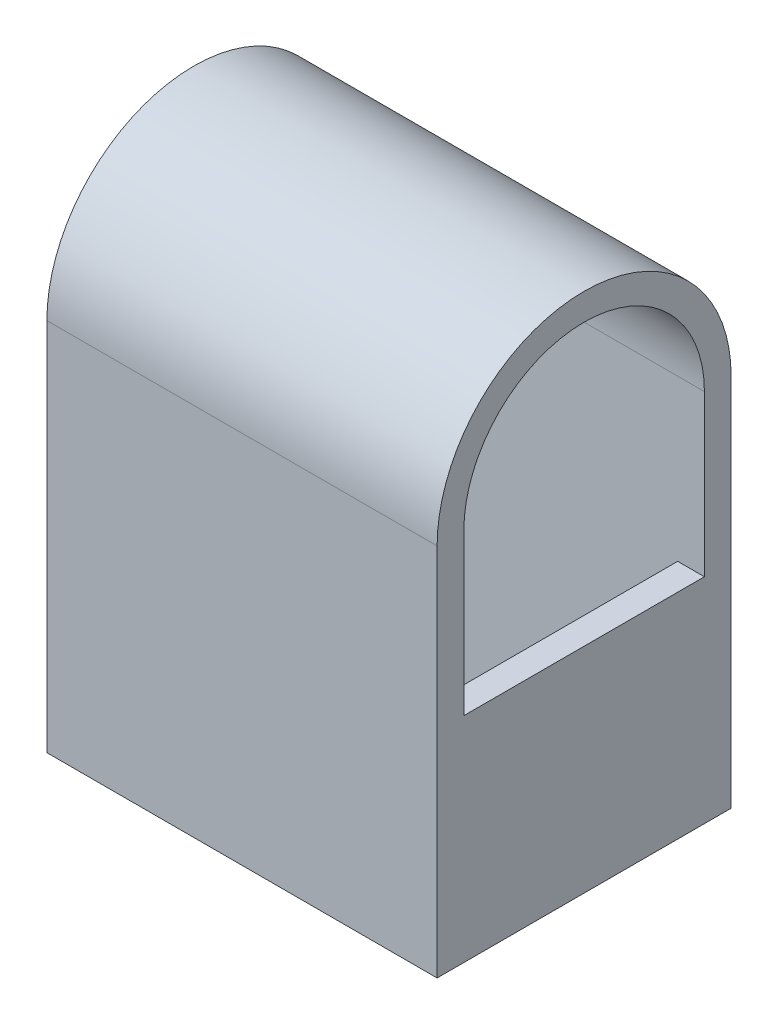
ISO-10303-21;
HEADER;
FILE_DESCRIPTION(('STEP AP214'),'2;1');
FILE_NAME('part.step','',(''),(''),'','','');
FILE_SCHEMA(('AUTOMOTIVE_DESIGN { 1 0 10303 214 1 1 1 1 }'));
ENDSEC;
DATA;
#1=APPLICATION_CONTEXT('core data for automotive mechanical design processes');
#2=APPLICATION_PROTOCOL_DEFINITION('international standard','automotive_design',2000,#1);
#3=PRODUCT_CONTEXT('',#1,'mechanical');
#4=PRODUCT('Part','Part','',(#3));
#5=PRODUCT_RELATED_PRODUCT_CATEGORY('part','',(#4));
#6=PRODUCT_DEFINITION_FORMATION('','',#4);
#7=PRODUCT_DEFINITION_CONTEXT('part definition',#1,'design');
#8=PRODUCT_DEFINITION('design','',#6,#7);
#9=PRODUCT_DEFINITION_SHAPE('','',#8);
#10=(LENGTH_UNIT() NAMED_UNIT(*) SI_UNIT(.MILLI.,.METRE.));
#11=(NAMED_UNIT(*) PLANE_ANGLE_UNIT() SI_UNIT($,.RADIAN.));
#12=(NAMED_UNIT(*) SI_UNIT($,.STERADIAN.) SOLID_ANGLE_UNIT());
#13=UNCERTAINTY_MEASURE_WITH_UNIT(LENGTH_MEASURE(1.E-05),#10,'distance_accuracy_value','');
#14=(GEOMETRIC_REPRESENTATION_CONTEXT(3) GLOBAL_UNCERTAINTY_ASSIGNED_CONTEXT((#13)) GLOBAL_UNIT_ASSIGNED_CONTEXT((#10,
#11,#12)) REPRESENTATION_CONTEXT('',''));
#15=CARTESIAN_POINT('',(0.,0.,0.));
#16=DIRECTION('',(0.,0.,1.));
#17=DIRECTION('',(1.,0.,0.));
#18=AXIS2_PLACEMENT_3D('',#15,#16,#17);
#19=CARTESIAN_POINT('',(0.,0.,-13.97));
#20=DIRECTION('',(0.,0.,1.));
#21=DIRECTION('',(1.,0.,0.));
#22=AXIS2_PLACEMENT_3D('',#19,#20,#21);
#23=PLANE('',#22);
#24=DIRECTION('',(0.,-1.,0.));
#25=VECTOR('',#24,1.);
#26=CARTESIAN_POINT('',(6.35,-8.89,-13.97));
#27=LINE('',#26,#25);
#28=CARTESIAN_POINT('',(6.35,3.81,-13.97));
#29=VERTEX_POINT('',#28);
#30=CARTESIAN_POINT('',(6.35,-8.89000000000001,-13.97));
#31=VERTEX_POINT('',#30);
#32=EDGE_CURVE('E218',#29,#31,#27,.T.);
#33=ORIENTED_EDGE('',*,*,#32,.F.);
#34=DIRECTION('',(1.,0.,0.));
#35=VECTOR('',#34,1.);
#36=CARTESIAN_POINT('',(6.35,3.81,-13.97));
#37=LINE('',#36,#35);
#38=CARTESIAN_POINT('',(5.08,3.81,-13.97));
#39=VERTEX_POINT('',#38);
#40=EDGE_CURVE('E241',#39,#29,#37,.T.);
#41=ORIENTED_EDGE('',*,*,#40,.F.);
#42=DIRECTION('',(0.,1.,0.));
#43=VECTOR('',#42,1.);
#44=CARTESIAN_POINT('',(5.08,-8.89000000000001,-13.97));
#45=LINE('',#44,#43);
#46=CARTESIAN_POINT('',(5.08,-8.89000000000001,-13.97));
#47=VERTEX_POINT('',#46);
#48=EDGE_CURVE('E216',#47,#39,#45,.T.);
#49=ORIENTED_EDGE('',*,*,#48,.F.);
#50=DIRECTION('',(1.,0.,0.));
#51=VECTOR('',#50,1.);
#52=CARTESIAN_POINT('',(-5.08,-8.89000000000001,-13.97));
#53=LINE('',#52,#51);
#54=CARTESIAN_POINT('',(-5.08,-8.89000000000001,-13.97));
#55=VERTEX_POINT('',#54);
#56=EDGE_CURVE('E206',#55,#47,#53,.T.);
#57=ORIENTED_EDGE('',*,*,#56,.F.);
#58=DIRECTION('',(0.,1.,0.));
#59=VECTOR('',#58,1.);
#60=CARTESIAN_POINT('',(-5.08,-8.89000000000001,-13.97));
#61=LINE('',#60,#59);
#62=CARTESIAN_POINT('',(-5.08,3.81,-13.97));
#63=VERTEX_POINT('',#62);
#64=EDGE_CURVE('E219',#55,#63,#61,.T.);
#65=ORIENTED_EDGE('',*,*,#64,.T.);
#66=CARTESIAN_POINT('',(-6.35,3.81,-13.97));
#67=VERTEX_POINT('',#66);
#68=EDGE_CURVE('E229',#67,#63,#37,.T.);
#69=ORIENTED_EDGE('',*,*,#68,.F.);
#70=DIRECTION('',(0.,1.,0.));
#71=VECTOR('',#70,1.);
#72=CARTESIAN_POINT('',(-6.35,3.81,-13.97));
#73=LINE('',#72,#71);
#74=CARTESIAN_POINT('',(-6.35,-8.89000000000001,-13.97));
#75=VERTEX_POINT('',#74);
#76=EDGE_CURVE('E238',#75,#67,#73,.T.);
#77=ORIENTED_EDGE('',*,*,#76,.F.);
#78=DIRECTION('',(1.,0.,0.));
#79=VECTOR('',#78,1.);
#80=CARTESIAN_POINT('',(9.271,-8.89000000000001,-13.97));
#81=LINE('',#80,#79);
#82=CARTESIAN_POINT('',(-9.271,-8.89000000000001,-13.97));
#83=VERTEX_POINT('',#82);
#84=EDGE_CURVE('E287',#83,#75,#81,.T.);
#85=ORIENTED_EDGE('',*,*,#84,.F.);
#86=DIRECTION('',(0.,-1.,0.));
#87=VECTOR('',#86,1.);
#88=CARTESIAN_POINT('',(-9.271,-8.89000000000001,-13.97));
#89=LINE('',#88,#87);
#90=CARTESIAN_POINT('',(-9.271,8.88999999999999,-13.97));
#91=VERTEX_POINT('',#90);
#92=EDGE_CURVE('E273',#91,#83,#89,.T.);
#93=ORIENTED_EDGE('',*,*,#92,.F.);
#94=DIRECTION('',(-1.,0.,0.));
#95=VECTOR('',#94,1.);
#96=CARTESIAN_POINT('',(24.889934822836,8.88999999999999,-13.97));
#97=LINE('',#96,#95);
#98=CARTESIAN_POINT('',(9.271,8.89,-13.97));
#99=VERTEX_POINT('',#98);
#100=EDGE_CURVE('E304',#99,#91,#97,.T.);
#101=ORIENTED_EDGE('',*,*,#100,.F.);
#102=DIRECTION('',(0.,1.,0.));
#103=VECTOR('',#102,1.);
#104=CARTESIAN_POINT('',(9.271,-8.89000000000001,-13.97));
#105=LINE('',#104,#103);
#106=CARTESIAN_POINT('',(9.271,-8.89000000000001,-13.97));
#107=VERTEX_POINT('',#106);
#108=EDGE_CURVE('E279',#107,#99,#105,.T.);
#109=ORIENTED_EDGE('',*,*,#108,.F.);
#110=EDGE_CURVE('E286',#31,#107,#81,.T.);
#111=ORIENTED_EDGE('',*,*,#110,.F.);
#112=EDGE_LOOP('',(#33,#41,#49,#57,#65,#69,#77,#85,#93,#101,#109,#111));
#113=FACE_BOUND('',#112,.T.);
#114=ADVANCED_FACE('F33',(#113),#23,.F.);
#115=CARTESIAN_POINT('',(9.271,-8.89,-1.27));
#116=DIRECTION('',(1.,0.,0.));
#117=DIRECTION('',(0.,0.,-1.));
#118=AXIS2_PLACEMENT_3D('',#115,#116,#117);
#119=PLANE('',#118);
#120=DIRECTION('',(0.,0.,1.));
#121=VECTOR('',#120,1.);
#122=CARTESIAN_POINT('',(9.271,1.27,-1.905));
#123=LINE('',#122,#121);
#124=CARTESIAN_POINT('',(9.271,1.27,-12.7));
#125=VERTEX_POINT('',#124);
#126=CARTESIAN_POINT('',(9.271,1.27,-1.27));
#127=VERTEX_POINT('',#126);
#128=EDGE_CURVE('E48',#125,#127,#123,.T.);
#129=ORIENTED_EDGE('',*,*,#128,.T.);
#130=DIRECTION('',(0.,1.,0.));
#131=VECTOR('',#130,1.);
#132=CARTESIAN_POINT('',(9.271,-8.89,-1.27));
#133=LINE('',#132,#131);
#134=CARTESIAN_POINT('',(9.271,8.89,-1.27));
#135=VERTEX_POINT('',#134);
#136=EDGE_CURVE('E189',#127,#135,#133,.T.);
#137=ORIENTED_EDGE('',*,*,#136,.T.);
#138=CARTESIAN_POINT('',(9.271,8.89,-6.985));
#139=DIRECTION('',(1.,0.,0.));
#140=DIRECTION('',(0.,0.,-1.));
#141=AXIS2_PLACEMENT_3D('',#138,#139,#140);
#142=CIRCLE('',#141,5.715);
#143=CARTESIAN_POINT('',(9.271,8.88999999999999,-12.7));
#144=VERTEX_POINT('',#143);
#145=EDGE_CURVE('E298',#144,#135,#142,.T.);
#146=ORIENTED_EDGE('',*,*,#145,.F.);
#147=DIRECTION('',(0.,1.,0.));
#148=VECTOR('',#147,1.);
#149=CARTESIAN_POINT('',(9.271,-8.89000000000001,-12.7));
#150=LINE('',#149,#148);
#151=EDGE_CURVE('E281',#125,#144,#150,.T.);
#152=ORIENTED_EDGE('',*,*,#151,.F.);
#153=EDGE_LOOP('',(#129,#137,#146,#152));
#154=FACE_BOUND('',#153,.T.);
#155=DIRECTION('',(0.,1.,0.));
#156=VECTOR('',#155,1.);
#157=CARTESIAN_POINT('',(9.271,-8.89,0.));
#158=LINE('',#157,#156);
#159=CARTESIAN_POINT('',(9.271,-8.89,0.));
#160=VERTEX_POINT('',#159);
#161=CARTESIAN_POINT('',(9.271,8.89,0.));
#162=VERTEX_POINT('',#161);
#163=EDGE_CURVE('E301',#160,#162,#158,.T.);
#164=ORIENTED_EDGE('',*,*,#163,.F.);
#165=DIRECTION('',(0.,0.,1.));
#166=VECTOR('',#165,1.);
#167=CARTESIAN_POINT('',(9.271,-8.89,-1.27));
#168=LINE('',#167,#166);
#169=EDGE_CURVE('E11',#107,#160,#168,.T.);
#170=ORIENTED_EDGE('',*,*,#169,.F.);
#171=ORIENTED_EDGE('',*,*,#108,.T.);
#172=CARTESIAN_POINT('',(9.271,8.89,-6.985));
#173=DIRECTION('',(1.,0.,0.));
#174=DIRECTION('',(0.,0.,-1.));
#175=AXIS2_PLACEMENT_3D('',#172,#173,#174);
#176=CIRCLE('',#175,6.985);
#177=EDGE_CURVE('E295',#162,#99,#176,.F.);
#178=ORIENTED_EDGE('',*,*,#177,.F.);
#179=EDGE_LOOP('',(#164,#170,#171,#178));
#180=FACE_BOUND('',#179,.T.);
#181=ADVANCED_FACE('F35',(#154,#180),#119,.T.);
#182=CARTESIAN_POINT('',(-9.271,-8.89,-1.27));
#183=DIRECTION('',(0.,-1.,0.));
#184=DIRECTION('',(0.,0.,-1.));
#185=AXIS2_PLACEMENT_3D('',#182,#183,#184);
#186=PLANE('',#185);
#187=ORIENTED_EDGE('',*,*,#110,.T.);
#188=ORIENTED_EDGE('',*,*,#169,.T.);
#189=DIRECTION('',(1.,0.,0.));
#190=VECTOR('',#189,1.);
#191=CARTESIAN_POINT('',(-9.271,-8.89,0.));
#192=LINE('',#191,#190);
#193=CARTESIAN_POINT('',(-9.271,-8.89,0.));
#194=VERTEX_POINT('',#193);
#195=EDGE_CURVE('E310',#194,#160,#192,.T.);
#196=ORIENTED_EDGE('',*,*,#195,.F.);
#197=DIRECTION('',(0.,0.,1.));
#198=VECTOR('',#197,1.);
#199=CARTESIAN_POINT('',(-9.271,-8.89,-1.27));
#200=LINE('',#199,#198);
#201=EDGE_CURVE('E37',#83,#194,#200,.T.);
#202=ORIENTED_EDGE('',*,*,#201,.F.);
#203=ORIENTED_EDGE('',*,*,#84,.T.);
#204=DIRECTION('',(0.,0.,1.));
#205=VECTOR('',#204,1.);
#206=CARTESIAN_POINT('',(-6.35,-8.89,-16.256));
#207=LINE('',#206,#205);
#208=CARTESIAN_POINT('',(-6.35,-8.89,-16.256));
#209=VERTEX_POINT('',#208);
#210=EDGE_CURVE('E249',#209,#75,#207,.T.);
#211=ORIENTED_EDGE('',*,*,#210,.F.);
#212=DIRECTION('',(-1.,0.,0.));
#213=VECTOR('',#212,1.);
#214=CARTESIAN_POINT('',(-6.35,-8.89,-16.256));
#215=LINE('',#214,#213);
#216=CARTESIAN_POINT('',(6.35,-8.89,-16.256));
#217=VERTEX_POINT('',#216);
#218=EDGE_CURVE('E228',#217,#209,#215,.T.);
#219=ORIENTED_EDGE('',*,*,#218,.F.);
#220=DIRECTION('',(0.,0.,1.));
#221=VECTOR('',#220,1.);
#222=CARTESIAN_POINT('',(6.35,-8.89,-16.256));
#223=LINE('',#222,#221);
#224=EDGE_CURVE('E252',#217,#31,#223,.T.);
#225=ORIENTED_EDGE('',*,*,#224,.T.);
#226=EDGE_LOOP('',(#187,#188,#196,#202,#203,#211,#219,#225));
#227=FACE_BOUND('',#226,.T.);
#228=DIRECTION('',(0.,0.,-1.));
#229=VECTOR('',#228,1.);
#230=CARTESIAN_POINT('',(5.08,-8.89000000000001,-13.97));
#231=LINE('',#230,#229);
#232=CARTESIAN_POINT('',(5.08,-8.89000000000001,-15.4932753966179));
#233=VERTEX_POINT('',#232);
#234=EDGE_CURVE('E196',#47,#233,#231,.T.);
#235=ORIENTED_EDGE('',*,*,#234,.T.);
#236=DIRECTION('',(-0.99968586256154,0.,-0.0250634433905168));
#237=VECTOR('',#236,1.);
#238=CARTESIAN_POINT('',(5.08,-8.89000000000001,-15.4932753966179));
#239=LINE('',#238,#237);
#240=CARTESIAN_POINT('',(-5.08,-8.89,-15.748));
#241=VERTEX_POINT('',#240);
#242=EDGE_CURVE('E199',#233,#241,#239,.T.);
#243=ORIENTED_EDGE('',*,*,#242,.T.);
#244=DIRECTION('',(0.,0.,1.));
#245=VECTOR('',#244,1.);
#246=CARTESIAN_POINT('',(-5.08,-8.89000000000001,-15.748));
#247=LINE('',#246,#245);
#248=EDGE_CURVE('E203',#241,#55,#247,.T.);
#249=ORIENTED_EDGE('',*,*,#248,.T.);
#250=ORIENTED_EDGE('',*,*,#56,.T.);
#251=EDGE_LOOP('',(#235,#243,#249,#250));
#252=FACE_BOUND('',#251,.T.);
#253=DIRECTION('',(1.,0.,0.));
#254=VECTOR('',#253,1.);
#255=CARTESIAN_POINT('',(-9.271,-8.89,-1.27));
#256=LINE('',#255,#254);
#257=CARTESIAN_POINT('',(-8.001,-8.89,-1.27));
#258=VERTEX_POINT('',#257);
#259=CARTESIAN_POINT('',(8.001,-8.89,-1.27));
#260=VERTEX_POINT('',#259);
#261=EDGE_CURVE('E315',#258,#260,#256,.T.);
#262=ORIENTED_EDGE('',*,*,#261,.T.);
#263=DIRECTION('',(0.,0.,-1.));
#264=VECTOR('',#263,1.);
#265=CARTESIAN_POINT('',(8.001,-8.89,-1.27));
#266=LINE('',#265,#264);
#267=CARTESIAN_POINT('',(8.001,-8.89000000000001,-12.7));
#268=VERTEX_POINT('',#267);
#269=EDGE_CURVE('E182',#260,#268,#266,.T.);
#270=ORIENTED_EDGE('',*,*,#269,.T.);
#271=DIRECTION('',(1.,0.,0.));
#272=VECTOR('',#271,1.);
#273=CARTESIAN_POINT('',(9.271,-8.89000000000001,-12.7));
#274=LINE('',#273,#272);
#275=CARTESIAN_POINT('',(-8.001,-8.89000000000001,-12.7));
#276=VERTEX_POINT('',#275);
#277=EDGE_CURVE('E278',#276,#268,#274,.T.);
#278=ORIENTED_EDGE('',*,*,#277,.F.);
#279=DIRECTION('',(0.,0.,1.));
#280=VECTOR('',#279,1.);
#281=CARTESIAN_POINT('',(-8.001,-8.89000000000001,-12.7));
#282=LINE('',#281,#280);
#283=EDGE_CURVE('E258',#276,#258,#282,.T.);
#284=ORIENTED_EDGE('',*,*,#283,.T.);
#285=EDGE_LOOP('',(#262,#270,#278,#284));
#286=FACE_BOUND('',#285,.T.);
#287=ADVANCED_FACE('F333',(#227,#252,#286),#186,.T.);
#288=CARTESIAN_POINT('',(-9.271,-8.89,-1.27));
#289=DIRECTION('',(-1.,0.,0.));
#290=DIRECTION('',(0.,0.,1.));
#291=AXIS2_PLACEMENT_3D('',#288,#289,#290);
#292=PLANE('',#291);
#293=DIRECTION('',(0.,-1.,0.));
#294=VECTOR('',#293,1.);
#295=CARTESIAN_POINT('',(-9.271,-8.89,-1.27));
#296=LINE('',#295,#294);
#297=CARTESIAN_POINT('',(-9.271,8.89,-1.27));
#298=VERTEX_POINT('',#297);
#299=CARTESIAN_POINT('',(-9.271,1.27,-1.27));
#300=VERTEX_POINT('',#299);
#301=EDGE_CURVE('E312',#298,#300,#296,.T.);
#302=ORIENTED_EDGE('',*,*,#301,.T.);
#303=DIRECTION('',(0.,0.,-1.));
#304=VECTOR('',#303,1.);
#305=CARTESIAN_POINT('',(-9.271,1.26999999999999,-12.7));
#306=LINE('',#305,#304);
#307=CARTESIAN_POINT('',(-9.271,1.27,-12.7));
#308=VERTEX_POINT('',#307);
#309=EDGE_CURVE('E255',#300,#308,#306,.T.);
#310=ORIENTED_EDGE('',*,*,#309,.T.);
#311=DIRECTION('',(0.,-1.,0.));
#312=VECTOR('',#311,1.);
#313=CARTESIAN_POINT('',(-9.271,-8.89000000000001,-12.7));
#314=LINE('',#313,#312);
#315=CARTESIAN_POINT('',(-9.271,8.88999999999999,-12.7));
#316=VERTEX_POINT('',#315);
#317=EDGE_CURVE('E276',#316,#308,#314,.T.);
#318=ORIENTED_EDGE('',*,*,#317,.F.);
#319=CARTESIAN_POINT('',(-9.271,8.89,-6.985));
#320=DIRECTION('',(1.,0.,0.));
#321=DIRECTION('',(0.,0.,-1.));
#322=AXIS2_PLACEMENT_3D('',#319,#320,#321);
#323=CIRCLE('',#322,5.715);
#324=EDGE_CURVE('E283',#316,#298,#323,.T.);
#325=ORIENTED_EDGE('',*,*,#324,.T.);
#326=EDGE_LOOP('',(#302,#310,#318,#325));
#327=FACE_BOUND('',#326,.T.);
#328=DIRECTION('',(0.,-1.,0.));
#329=VECTOR('',#328,1.);
#330=CARTESIAN_POINT('',(-9.271,-8.89,0.));
#331=LINE('',#330,#329);
#332=CARTESIAN_POINT('',(-9.271,8.89,0.));
#333=VERTEX_POINT('',#332);
#334=EDGE_CURVE('E322',#333,#194,#331,.T.);
#335=ORIENTED_EDGE('',*,*,#334,.F.);
#336=CARTESIAN_POINT('',(-9.271,8.89,-6.985));
#337=DIRECTION('',(-1.,0.,0.));
#338=DIRECTION('',(0.,0.,1.));
#339=AXIS2_PLACEMENT_3D('',#336,#337,#338);
#340=CIRCLE('',#339,6.985);
#341=EDGE_CURVE('E292',#333,#91,#340,.T.);
#342=ORIENTED_EDGE('',*,*,#341,.T.);
#343=ORIENTED_EDGE('',*,*,#92,.T.);
#344=ORIENTED_EDGE('',*,*,#201,.T.);
#345=EDGE_LOOP('',(#335,#342,#343,#344));
#346=FACE_BOUND('',#345,.T.);
#347=ADVANCED_FACE('F344',(#327,#346),#292,.T.);
#348=CARTESIAN_POINT('',(0.,0.,-1.27));
#349=DIRECTION('',(0.,0.,-1.));
#350=DIRECTION('',(-1.,0.,0.));
#351=AXIS2_PLACEMENT_3D('',#348,#349,#350);
#352=PLANE('',#351);
#353=DIRECTION('',(1.,0.,0.));
#354=VECTOR('',#353,1.);
#355=CARTESIAN_POINT('',(8.001,1.27,-1.27));
#356=LINE('',#355,#354);
#357=CARTESIAN_POINT('',(8.001,1.27,-1.27));
#358=VERTEX_POINT('',#357);
#359=EDGE_CURVE('E173',#358,#127,#356,.T.);
#360=ORIENTED_EDGE('',*,*,#359,.F.);
#361=DIRECTION('',(0.,-1.,0.));
#362=VECTOR('',#361,1.);
#363=CARTESIAN_POINT('',(8.001,1.27,-1.27));
#364=LINE('',#363,#362);
#365=EDGE_CURVE('E177',#358,#260,#364,.T.);
#366=ORIENTED_EDGE('',*,*,#365,.T.);
#367=ORIENTED_EDGE('',*,*,#261,.F.);
#368=DIRECTION('',(0.,1.,0.));
#369=VECTOR('',#368,1.);
#370=CARTESIAN_POINT('',(-8.001,-8.89,-1.27));
#371=LINE('',#370,#369);
#372=CARTESIAN_POINT('',(-8.001,1.27,-1.27));
#373=VERTEX_POINT('',#372);
#374=EDGE_CURVE('E261',#258,#373,#371,.T.);
#375=ORIENTED_EDGE('',*,*,#374,.T.);
#376=DIRECTION('',(-1.,0.,0.));
#377=VECTOR('',#376,1.);
#378=CARTESIAN_POINT('',(-8.001,1.27,-1.27));
#379=LINE('',#378,#377);
#380=EDGE_CURVE('E267',#373,#300,#379,.T.);
#381=ORIENTED_EDGE('',*,*,#380,.T.);
#382=ORIENTED_EDGE('',*,*,#301,.F.);
#383=DIRECTION('',(-1.,0.,0.));
#384=VECTOR('',#383,1.);
#385=CARTESIAN_POINT('',(-9.271,8.89,-1.27));
#386=LINE('',#385,#384);
#387=EDGE_CURVE('E309',#135,#298,#386,.T.);
#388=ORIENTED_EDGE('',*,*,#387,.F.);
#389=ORIENTED_EDGE('',*,*,#136,.F.);
#390=EDGE_LOOP('',(#360,#366,#367,#375,#381,#382,#388,#389));
#391=FACE_BOUND('',#390,.T.);
#392=ADVANCED_FACE('F187',(#391),#352,.T.);
#393=CARTESIAN_POINT('',(0.,0.,0.));
#394=DIRECTION('',(0.,0.,-1.));
#395=DIRECTION('',(-1.,0.,0.));
#396=AXIS2_PLACEMENT_3D('',#393,#394,#395);
#397=PLANE('',#396);
#398=ORIENTED_EDGE('',*,*,#163,.T.);
#399=DIRECTION('',(-1.,0.,0.));
#400=VECTOR('',#399,1.);
#401=CARTESIAN_POINT('',(-9.271,8.89,0.));
#402=LINE('',#401,#400);
#403=EDGE_CURVE('E319',#162,#333,#402,.T.);
#404=ORIENTED_EDGE('',*,*,#403,.T.);
#405=ORIENTED_EDGE('',*,*,#334,.T.);
#406=ORIENTED_EDGE('',*,*,#195,.T.);
#407=EDGE_LOOP('',(#398,#404,#405,#406));
#408=FACE_BOUND('',#407,.T.);
#409=ADVANCED_FACE('F328',(#408),#397,.F.);
#410=CARTESIAN_POINT('',(24.889934822836,8.89,-6.985));
#411=DIRECTION('',(-1.,0.,0.));
#412=DIRECTION('',(0.,0.,1.));
#413=AXIS2_PLACEMENT_3D('',#410,#411,#412);
#414=CYLINDRICAL_SURFACE('',#413,6.985);
#415=ORIENTED_EDGE('',*,*,#403,.F.);
#416=ORIENTED_EDGE('',*,*,#177,.T.);
#417=ORIENTED_EDGE('',*,*,#100,.T.);
#418=ORIENTED_EDGE('',*,*,#341,.F.);
#419=EDGE_LOOP('',(#415,#416,#417,#418));
#420=FACE_BOUND('',#419,.T.);
#421=ADVANCED_FACE('F341',(#420),#414,.T.);
#422=CARTESIAN_POINT('',(24.889934822836,8.89,-6.985));
#423=DIRECTION('',(-1.,0.,0.));
#424=DIRECTION('',(0.,0.,1.));
#425=AXIS2_PLACEMENT_3D('',#422,#423,#424);
#426=CYLINDRICAL_SURFACE('',#425,5.715);
#427=DIRECTION('',(-1.,0.,0.));
#428=VECTOR('',#427,1.);
#429=CARTESIAN_POINT('',(24.889934822836,8.88999999999999,-12.7));
#430=LINE('',#429,#428);
#431=EDGE_CURVE('E302',#144,#316,#430,.T.);
#432=ORIENTED_EDGE('',*,*,#431,.F.);
#433=ORIENTED_EDGE('',*,*,#145,.T.);
#434=ORIENTED_EDGE('',*,*,#387,.T.);
#435=ORIENTED_EDGE('',*,*,#324,.F.);
#436=EDGE_LOOP('',(#432,#433,#434,#435));
#437=FACE_BOUND('',#436,.T.);
#438=ADVANCED_FACE('F395',(#437),#426,.F.);
#439=CARTESIAN_POINT('',(0.,0.,-12.7));
#440=DIRECTION('',(0.,0.,1.));
#441=DIRECTION('',(1.,0.,0.));
#442=AXIS2_PLACEMENT_3D('',#439,#440,#441);
#443=PLANE('',#442);
#444=DIRECTION('',(1.,0.,0.));
#445=VECTOR('',#444,1.);
#446=CARTESIAN_POINT('',(8.001,1.27,-12.7));
#447=LINE('',#446,#445);
#448=CARTESIAN_POINT('',(8.001,1.27,-12.7));
#449=VERTEX_POINT('',#448);
#450=EDGE_CURVE('E175',#449,#125,#447,.T.);
#451=ORIENTED_EDGE('',*,*,#450,.T.);
#452=ORIENTED_EDGE('',*,*,#151,.T.);
#453=ORIENTED_EDGE('',*,*,#431,.T.);
#454=ORIENTED_EDGE('',*,*,#317,.T.);
#455=DIRECTION('',(-1.,0.,0.));
#456=VECTOR('',#455,1.);
#457=CARTESIAN_POINT('',(-8.001,1.26999999999999,-12.7));
#458=LINE('',#457,#456);
#459=CARTESIAN_POINT('',(-8.001,1.27,-12.7));
#460=VERTEX_POINT('',#459);
#461=EDGE_CURVE('E270',#460,#308,#458,.T.);
#462=ORIENTED_EDGE('',*,*,#461,.F.);
#463=DIRECTION('',(0.,-1.,0.));
#464=VECTOR('',#463,1.);
#465=CARTESIAN_POINT('',(-8.001,-8.89000000000001,-12.7));
#466=LINE('',#465,#464);
#467=EDGE_CURVE('E256',#460,#276,#466,.T.);
#468=ORIENTED_EDGE('',*,*,#467,.T.);
#469=ORIENTED_EDGE('',*,*,#277,.T.);
#470=DIRECTION('',(0.,1.,0.));
#471=VECTOR('',#470,1.);
#472=CARTESIAN_POINT('',(8.001,-8.89000000000001,-12.7));
#473=LINE('',#472,#471);
#474=EDGE_CURVE('E56',#268,#449,#473,.T.);
#475=ORIENTED_EDGE('',*,*,#474,.T.);
#476=EDGE_LOOP('',(#451,#452,#453,#454,#462,#468,#469,#475));
#477=FACE_BOUND('',#476,.T.);
#478=ADVANCED_FACE('F393',(#477),#443,.T.);
#479=CARTESIAN_POINT('',(-8.001,1.26999999999999,-12.7));
#480=DIRECTION('',(0.,1.,0.));
#481=DIRECTION('',(0.,0.,1.));
#482=AXIS2_PLACEMENT_3D('',#479,#480,#481);
#483=PLANE('',#482);
#484=ORIENTED_EDGE('',*,*,#309,.F.);
#485=ORIENTED_EDGE('',*,*,#380,.F.);
#486=DIRECTION('',(0.,0.,-1.));
#487=VECTOR('',#486,1.);
#488=CARTESIAN_POINT('',(-8.001,1.26999999999999,-12.7));
#489=LINE('',#488,#487);
#490=EDGE_CURVE('E264',#373,#460,#489,.T.);
#491=ORIENTED_EDGE('',*,*,#490,.T.);
#492=ORIENTED_EDGE('',*,*,#461,.T.);
#493=EDGE_LOOP('',(#484,#485,#491,#492));
#494=FACE_BOUND('',#493,.T.);
#495=ADVANCED_FACE('F414',(#494),#483,.T.);
#496=CARTESIAN_POINT('',(-8.001,0.,0.));
#497=DIRECTION('',(1.,0.,0.));
#498=DIRECTION('',(0.,0.,-1.));
#499=AXIS2_PLACEMENT_3D('',#496,#497,#498);
#500=PLANE('',#499);
#501=ORIENTED_EDGE('',*,*,#467,.F.);
#502=ORIENTED_EDGE('',*,*,#490,.F.);
#503=ORIENTED_EDGE('',*,*,#374,.F.);
#504=ORIENTED_EDGE('',*,*,#283,.F.);
#505=EDGE_LOOP('',(#501,#502,#503,#504));
#506=FACE_BOUND('',#505,.T.);
#507=ADVANCED_FACE('F417',(#506),#500,.T.);
#508=CARTESIAN_POINT('',(6.35,-8.89,-16.256));
#509=DIRECTION('',(-1.,0.,0.));
#510=DIRECTION('',(0.,0.,1.));
#511=AXIS2_PLACEMENT_3D('',#508,#509,#510);
#512=PLANE('',#511);
#513=ORIENTED_EDGE('',*,*,#32,.T.);
#514=ORIENTED_EDGE('',*,*,#224,.F.);
#515=DIRECTION('',(0.,-1.,0.));
#516=VECTOR('',#515,1.);
#517=CARTESIAN_POINT('',(6.35,-8.89,-16.256));
#518=LINE('',#517,#516);
#519=CARTESIAN_POINT('',(6.35,3.81,-16.256));
#520=VERTEX_POINT('',#519);
#521=EDGE_CURVE('E225',#520,#217,#518,.T.);
#522=ORIENTED_EDGE('',*,*,#521,.F.);
#523=DIRECTION('',(0.,0.,1.));
#524=VECTOR('',#523,1.);
#525=CARTESIAN_POINT('',(6.35,3.81,-16.256));
#526=LINE('',#525,#524);
#527=EDGE_CURVE('E235',#520,#29,#526,.T.);
#528=ORIENTED_EDGE('',*,*,#527,.T.);
#529=EDGE_LOOP('',(#513,#514,#522,#528));
#530=FACE_BOUND('',#529,.T.);
#531=ADVANCED_FACE('F359',(#530),#512,.F.);
#532=CARTESIAN_POINT('',(-6.35,3.81,-16.256));
#533=DIRECTION('',(1.,0.,0.));
#534=DIRECTION('',(0.,0.,-1.));
#535=AXIS2_PLACEMENT_3D('',#532,#533,#534);
#536=PLANE('',#535);
#537=ORIENTED_EDGE('',*,*,#76,.T.);
#538=DIRECTION('',(0.,0.,1.));
#539=VECTOR('',#538,1.);
#540=CARTESIAN_POINT('',(-6.35,3.81,-16.256));
#541=LINE('',#540,#539);
#542=CARTESIAN_POINT('',(-6.35,3.81,-16.256));
#543=VERTEX_POINT('',#542);
#544=EDGE_CURVE('E246',#543,#67,#541,.T.);
#545=ORIENTED_EDGE('',*,*,#544,.F.);
#546=DIRECTION('',(0.,1.,0.));
#547=VECTOR('',#546,1.);
#548=CARTESIAN_POINT('',(-6.35,3.81,-16.256));
#549=LINE('',#548,#547);
#550=EDGE_CURVE('E231',#209,#543,#549,.T.);
#551=ORIENTED_EDGE('',*,*,#550,.F.);
#552=ORIENTED_EDGE('',*,*,#210,.T.);
#553=EDGE_LOOP('',(#537,#545,#551,#552));
#554=FACE_BOUND('',#553,.T.);
#555=ADVANCED_FACE('F350',(#554),#536,.F.);
#556=CARTESIAN_POINT('',(6.35,3.81,-16.256));
#557=DIRECTION('',(0.,-1.,0.));
#558=DIRECTION('',(0.,0.,-1.));
#559=AXIS2_PLACEMENT_3D('',#556,#557,#558);
#560=PLANE('',#559);
#561=DIRECTION('',(-0.99968586256154,0.,-0.0250634433905168));
#562=VECTOR('',#561,1.);
#563=CARTESIAN_POINT('',(5.08,3.81,-15.4932753966179));
#564=LINE('',#563,#562);
#565=CARTESIAN_POINT('',(5.08,3.81,-15.4932753966179));
#566=VERTEX_POINT('',#565);
#567=CARTESIAN_POINT('',(-5.08,3.81,-15.748));
#568=VERTEX_POINT('',#567);
#569=EDGE_CURVE('E211',#566,#568,#564,.T.);
#570=ORIENTED_EDGE('',*,*,#569,.F.);
#571=DIRECTION('',(0.,0.,-1.));
#572=VECTOR('',#571,1.);
#573=CARTESIAN_POINT('',(5.08,3.81,-13.97));
#574=LINE('',#573,#572);
#575=EDGE_CURVE('E191',#39,#566,#574,.T.);
#576=ORIENTED_EDGE('',*,*,#575,.F.);
#577=ORIENTED_EDGE('',*,*,#40,.T.);
#578=ORIENTED_EDGE('',*,*,#527,.F.);
#579=DIRECTION('',(1.,0.,0.));
#580=VECTOR('',#579,1.);
#581=CARTESIAN_POINT('',(6.35,3.81,-16.256));
#582=LINE('',#581,#580);
#583=EDGE_CURVE('E233',#543,#520,#582,.T.);
#584=ORIENTED_EDGE('',*,*,#583,.F.);
#585=ORIENTED_EDGE('',*,*,#544,.T.);
#586=ORIENTED_EDGE('',*,*,#68,.T.);
#587=DIRECTION('',(0.,0.,1.));
#588=VECTOR('',#587,1.);
#589=CARTESIAN_POINT('',(-5.08,3.81,-15.748));
#590=LINE('',#589,#588);
#591=EDGE_CURVE('E200',#568,#63,#590,.T.);
#592=ORIENTED_EDGE('',*,*,#591,.F.);
#593=EDGE_LOOP('',(#570,#576,#577,#578,#584,#585,#586,#592));
#594=FACE_BOUND('',#593,.T.);
#595=ADVANCED_FACE('F366',(#594),#560,.F.);
#596=CARTESIAN_POINT('',(0.,0.,-16.256));
#597=DIRECTION('',(0.,0.,1.));
#598=DIRECTION('',(1.,0.,0.));
#599=AXIS2_PLACEMENT_3D('',#596,#597,#598);
#600=PLANE('',#599);
#601=ORIENTED_EDGE('',*,*,#521,.T.);
#602=ORIENTED_EDGE('',*,*,#218,.T.);
#603=ORIENTED_EDGE('',*,*,#550,.T.);
#604=ORIENTED_EDGE('',*,*,#583,.T.);
#605=EDGE_LOOP('',(#601,#602,#603,#604));
#606=FACE_BOUND('',#605,.T.);
#607=ADVANCED_FACE('F354',(#606),#600,.F.);
#608=CARTESIAN_POINT('',(5.08,-8.89000000000001,-13.97));
#609=DIRECTION('',(1.,0.,0.));
#610=DIRECTION('',(0.,0.,-1.));
#611=AXIS2_PLACEMENT_3D('',#608,#609,#610);
#612=PLANE('',#611);
#613=ORIENTED_EDGE('',*,*,#575,.T.);
#614=DIRECTION('',(0.,1.,0.));
#615=VECTOR('',#614,1.);
#616=CARTESIAN_POINT('',(5.08,-8.89000000000001,-15.4932753966179));
#617=LINE('',#616,#615);
#618=EDGE_CURVE('E209',#233,#566,#617,.T.);
#619=ORIENTED_EDGE('',*,*,#618,.F.);
#620=ORIENTED_EDGE('',*,*,#234,.F.);
#621=ORIENTED_EDGE('',*,*,#48,.T.);
#622=EDGE_LOOP('',(#613,#619,#620,#621));
#623=FACE_BOUND('',#622,.T.);
#624=ADVANCED_FACE('F369',(#623),#612,.F.);
#625=CARTESIAN_POINT('',(-5.08,-8.89000000000001,-15.748));
#626=DIRECTION('',(-1.,0.,0.));
#627=DIRECTION('',(0.,0.,1.));
#628=AXIS2_PLACEMENT_3D('',#625,#626,#627);
#629=PLANE('',#628);
#630=ORIENTED_EDGE('',*,*,#591,.T.);
#631=ORIENTED_EDGE('',*,*,#64,.F.);
#632=ORIENTED_EDGE('',*,*,#248,.F.);
#633=DIRECTION('',(0.,1.,0.));
#634=VECTOR('',#633,1.);
#635=CARTESIAN_POINT('',(-5.08,-8.89000000000001,-15.748));
#636=LINE('',#635,#634);
#637=EDGE_CURVE('E221',#241,#568,#636,.T.);
#638=ORIENTED_EDGE('',*,*,#637,.T.);
#639=EDGE_LOOP('',(#630,#631,#632,#638));
#640=FACE_BOUND('',#639,.T.);
#641=ADVANCED_FACE('F376',(#640),#629,.F.);
#642=CARTESIAN_POINT('',(5.08,-8.89000000000001,-15.4932753966179));
#643=DIRECTION('',(0.0250634433905168,0.,-0.99968586256154));
#644=DIRECTION('',(-0.99968586256154,0.,-0.0250634433905168));
#645=AXIS2_PLACEMENT_3D('',#642,#643,#644);
#646=PLANE('',#645);
#647=ORIENTED_EDGE('',*,*,#569,.T.);
#648=ORIENTED_EDGE('',*,*,#637,.F.);
#649=ORIENTED_EDGE('',*,*,#242,.F.);
#650=ORIENTED_EDGE('',*,*,#618,.T.);
#651=EDGE_LOOP('',(#647,#648,#649,#650));
#652=FACE_BOUND('',#651,.T.);
#653=ADVANCED_FACE('F372',(#652),#646,.F.);
#654=CARTESIAN_POINT('',(8.001,1.27,-1.905));
#655=DIRECTION('',(0.,1.,0.));
#656=DIRECTION('',(0.,0.,1.));
#657=AXIS2_PLACEMENT_3D('',#654,#655,#656);
#658=PLANE('',#657);
#659=ORIENTED_EDGE('',*,*,#128,.F.);
#660=ORIENTED_EDGE('',*,*,#450,.F.);
#661=DIRECTION('',(0.,0.,1.));
#662=VECTOR('',#661,1.);
#663=CARTESIAN_POINT('',(8.001,1.27,-10.795));
#664=LINE('',#663,#662);
#665=EDGE_CURVE('E169',#449,#358,#664,.T.);
#666=ORIENTED_EDGE('',*,*,#665,.T.);
#667=ORIENTED_EDGE('',*,*,#359,.T.);
#668=EDGE_LOOP('',(#659,#660,#666,#667));
#669=FACE_BOUND('',#668,.T.);
#670=ADVANCED_FACE('F171',(#669),#658,.T.);
#671=CARTESIAN_POINT('',(8.001,0.,0.));
#672=DIRECTION('',(1.,0.,0.));
#673=DIRECTION('',(0.,0.,-1.));
#674=AXIS2_PLACEMENT_3D('',#671,#672,#673);
#675=PLANE('',#674);
#676=ORIENTED_EDGE('',*,*,#665,.F.);
#677=ORIENTED_EDGE('',*,*,#474,.F.);
#678=ORIENTED_EDGE('',*,*,#269,.F.);
#679=ORIENTED_EDGE('',*,*,#365,.F.);
#680=EDGE_LOOP('',(#676,#677,#678,#679));
#681=FACE_BOUND('',#680,.T.);
#682=ADVANCED_FACE('F180',(#681),#675,.F.);
#683=CLOSED_SHELL('',(#114,#181,#287,#347,#392,#409,#421,#438,#478,#495,#507,#531,#555,#595,
#607,#624,#641,#653,#670,#682));
#684=MANIFOLD_SOLID_BREP('B2',#683);
#685=ADVANCED_BREP_SHAPE_REPRESENTATION('',(#18,#684),#14);
#686=SHAPE_DEFINITION_REPRESENTATION(#9,#685);
ENDSEC;
END-ISO-10303-21;
